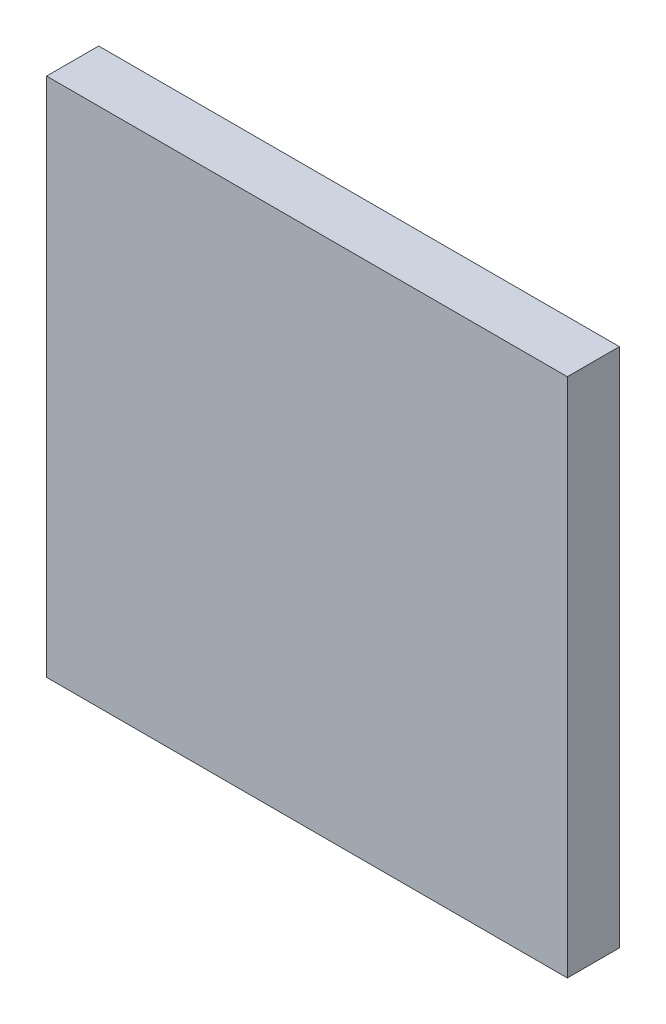
ISO-10303-21;
HEADER;
FILE_DESCRIPTION(('STEP AP214'),'2;1');
FILE_NAME('part.step','',(''),(''),'','','');
FILE_SCHEMA(('AUTOMOTIVE_DESIGN { 1 0 10303 214 1 1 1 1 }'));
ENDSEC;
DATA;
#1=APPLICATION_CONTEXT('core data for automotive mechanical design processes');
#2=APPLICATION_PROTOCOL_DEFINITION('international standard','automotive_design',2000,#1);
#3=PRODUCT_CONTEXT('',#1,'mechanical');
#4=PRODUCT('Part','Part','',(#3));
#5=PRODUCT_RELATED_PRODUCT_CATEGORY('part','',(#4));
#6=PRODUCT_DEFINITION_FORMATION('','',#4);
#7=PRODUCT_DEFINITION_CONTEXT('part definition',#1,'design');
#8=PRODUCT_DEFINITION('design','',#6,#7);
#9=PRODUCT_DEFINITION_SHAPE('','',#8);
#10=(LENGTH_UNIT() NAMED_UNIT(*) SI_UNIT(.MILLI.,.METRE.));
#11=(NAMED_UNIT(*) PLANE_ANGLE_UNIT() SI_UNIT($,.RADIAN.));
#12=(NAMED_UNIT(*) SI_UNIT($,.STERADIAN.) SOLID_ANGLE_UNIT());
#13=UNCERTAINTY_MEASURE_WITH_UNIT(LENGTH_MEASURE(1.E-05),#10,'distance_accuracy_value','');
#14=(GEOMETRIC_REPRESENTATION_CONTEXT(3) GLOBAL_UNCERTAINTY_ASSIGNED_CONTEXT((#13)) GLOBAL_UNIT_ASSIGNED_CONTEXT((#10,
#11,#12)) REPRESENTATION_CONTEXT('',''));
#15=CARTESIAN_POINT('',(0.,0.,0.));
#16=DIRECTION('',(0.,0.,1.));
#17=DIRECTION('',(1.,0.,0.));
#18=AXIS2_PLACEMENT_3D('',#15,#16,#17);
#19=CARTESIAN_POINT('',(0.,0.,100.));
#20=DIRECTION('',(0.,1.,0.));
#21=DIRECTION('',(0.,0.,1.));
#22=AXIS2_PLACEMENT_3D('',#19,#20,#21);
#23=PLANE('',#22);
#24=DIRECTION('',(0.,0.,-1.));
#25=VECTOR('',#24,1.);
#26=CARTESIAN_POINT('',(550.,0.,100.));
#27=LINE('',#26,#25);
#28=CARTESIAN_POINT('',(550.,0.,100.));
#29=VERTEX_POINT('',#28);
#30=CARTESIAN_POINT('',(550.,0.,0.));
#31=VERTEX_POINT('',#30);
#32=EDGE_CURVE('E11',#29,#31,#27,.T.);
#33=ORIENTED_EDGE('',*,*,#32,.F.);
#34=DIRECTION('',(1.,0.,0.));
#35=VECTOR('',#34,1.);
#36=CARTESIAN_POINT('',(0.,0.,100.));
#37=LINE('',#36,#35);
#38=CARTESIAN_POINT('',(450.,0.,100.));
#39=VERTEX_POINT('',#38);
#40=EDGE_CURVE('E100',#39,#29,#37,.T.);
#41=ORIENTED_EDGE('',*,*,#40,.F.);
#42=DIRECTION('',(0.,0.,-1.));
#43=VECTOR('',#42,1.);
#44=CARTESIAN_POINT('',(450.,0.,100.));
#45=LINE('',#44,#43);
#46=CARTESIAN_POINT('',(450.,0.,0.));
#47=VERTEX_POINT('',#46);
#48=EDGE_CURVE('E48',#39,#47,#45,.T.);
#49=ORIENTED_EDGE('',*,*,#48,.T.);
#50=DIRECTION('',(1.,0.,0.));
#51=VECTOR('',#50,1.);
#52=CARTESIAN_POINT('',(0.,0.,0.));
#53=LINE('',#52,#51);
#54=EDGE_CURVE('E131',#47,#31,#53,.T.);
#55=ORIENTED_EDGE('',*,*,#54,.T.);
#56=EDGE_LOOP('',(#33,#41,#49,#55));
#57=FACE_BOUND('',#56,.T.);
#58=ADVANCED_FACE('F39',(#57),#23,.F.);
#59=ORIENTED_EDGE('',*,*,#48,.F.);
#60=CARTESIAN_POINT('',(0.,0.,100.));
#61=VERTEX_POINT('',#60);
#62=EDGE_CURVE('E90',#61,#39,#37,.T.);
#63=ORIENTED_EDGE('',*,*,#62,.F.);
#64=DIRECTION('',(0.,0.,-1.));
#65=VECTOR('',#64,1.);
#66=CARTESIAN_POINT('',(0.,0.,100.));
#67=LINE('',#66,#65);
#68=CARTESIAN_POINT('',(0.,0.,0.));
#69=VERTEX_POINT('',#68);
#70=EDGE_CURVE('E95',#61,#69,#67,.T.);
#71=ORIENTED_EDGE('',*,*,#70,.T.);
#72=EDGE_CURVE('E129',#69,#47,#53,.T.);
#73=ORIENTED_EDGE('',*,*,#72,.T.);
#74=EDGE_LOOP('',(#59,#63,#71,#73));
#75=FACE_BOUND('',#74,.T.);
#76=ADVANCED_FACE('F92',(#75),#23,.F.);
#77=CARTESIAN_POINT('',(0.,0.,100.));
#78=DIRECTION('',(1.,0.,0.));
#79=DIRECTION('',(0.,0.,-1.));
#80=AXIS2_PLACEMENT_3D('',#77,#78,#79);
#81=PLANE('',#80);
#82=DIRECTION('',(0.,-1.,0.));
#83=VECTOR('',#82,1.);
#84=CARTESIAN_POINT('',(0.,0.,0.));
#85=LINE('',#84,#83);
#86=CARTESIAN_POINT('',(0.,1000.,0.));
#87=VERTEX_POINT('',#86);
#88=EDGE_CURVE('E114',#87,#69,#85,.T.);
#89=ORIENTED_EDGE('',*,*,#88,.T.);
#90=ORIENTED_EDGE('',*,*,#70,.F.);
#91=DIRECTION('',(0.,-1.,0.));
#92=VECTOR('',#91,1.);
#93=CARTESIAN_POINT('',(0.,0.,100.));
#94=LINE('',#93,#92);
#95=CARTESIAN_POINT('',(0.,1000.,100.));
#96=VERTEX_POINT('',#95);
#97=EDGE_CURVE('E104',#96,#61,#94,.T.);
#98=ORIENTED_EDGE('',*,*,#97,.F.);
#99=DIRECTION('',(0.,0.,-1.));
#100=VECTOR('',#99,1.);
#101=CARTESIAN_POINT('',(0.,1000.,100.));
#102=LINE('',#101,#100);
#103=EDGE_CURVE('E124',#96,#87,#102,.T.);
#104=ORIENTED_EDGE('',*,*,#103,.T.);
#105=EDGE_LOOP('',(#89,#90,#98,#104));
#106=FACE_BOUND('',#105,.T.);
#107=ADVANCED_FACE('F41',(#106),#81,.F.);
#108=CARTESIAN_POINT('',(1000.,0.,100.));
#109=VERTEX_POINT('',#108);
#110=EDGE_CURVE('E102',#29,#109,#37,.T.);
#111=ORIENTED_EDGE('',*,*,#110,.F.);
#112=ORIENTED_EDGE('',*,*,#32,.T.);
#113=CARTESIAN_POINT('',(1000.,0.,0.));
#114=VERTEX_POINT('',#113);
#115=EDGE_CURVE('E132',#31,#114,#53,.T.);
#116=ORIENTED_EDGE('',*,*,#115,.T.);
#117=DIRECTION('',(0.,0.,-1.));
#118=VECTOR('',#117,1.);
#119=CARTESIAN_POINT('',(1000.,0.,100.));
#120=LINE('',#119,#118);
#121=EDGE_CURVE('E115',#109,#114,#120,.T.);
#122=ORIENTED_EDGE('',*,*,#121,.F.);
#123=EDGE_LOOP('',(#111,#112,#116,#122));
#124=FACE_BOUND('',#123,.T.);
#125=ADVANCED_FACE('F147',(#124),#23,.F.);
#126=CARTESIAN_POINT('',(1000.,0.,100.));
#127=DIRECTION('',(-1.,0.,0.));
#128=DIRECTION('',(0.,0.,1.));
#129=AXIS2_PLACEMENT_3D('',#126,#127,#128);
#130=PLANE('',#129);
#131=DIRECTION('',(0.,1.,0.));
#132=VECTOR('',#131,1.);
#133=CARTESIAN_POINT('',(1000.,0.,0.));
#134=LINE('',#133,#132);
#135=CARTESIAN_POINT('',(1000.,1000.,0.));
#136=VERTEX_POINT('',#135);
#137=EDGE_CURVE('E127',#114,#136,#134,.T.);
#138=ORIENTED_EDGE('',*,*,#137,.T.);
#139=DIRECTION('',(0.,0.,-1.));
#140=VECTOR('',#139,1.);
#141=CARTESIAN_POINT('',(1000.,1000.,100.));
#142=LINE('',#141,#140);
#143=CARTESIAN_POINT('',(1000.,1000.,100.));
#144=VERTEX_POINT('',#143);
#145=EDGE_CURVE('E119',#144,#136,#142,.T.);
#146=ORIENTED_EDGE('',*,*,#145,.F.);
#147=DIRECTION('',(0.,1.,0.));
#148=VECTOR('',#147,1.);
#149=CARTESIAN_POINT('',(1000.,0.,100.));
#150=LINE('',#149,#148);
#151=EDGE_CURVE('E99',#109,#144,#150,.T.);
#152=ORIENTED_EDGE('',*,*,#151,.F.);
#153=ORIENTED_EDGE('',*,*,#121,.T.);
#154=EDGE_LOOP('',(#138,#146,#152,#153));
#155=FACE_BOUND('',#154,.T.);
#156=ADVANCED_FACE('F139',(#155),#130,.F.);
#157=CARTESIAN_POINT('',(0.,1000.,100.));
#158=DIRECTION('',(0.,-1.,0.));
#159=DIRECTION('',(0.,0.,-1.));
#160=AXIS2_PLACEMENT_3D('',#157,#158,#159);
#161=PLANE('',#160);
#162=DIRECTION('',(-1.,0.,0.));
#163=VECTOR('',#162,1.);
#164=CARTESIAN_POINT('',(0.,1000.,0.));
#165=LINE('',#164,#163);
#166=EDGE_CURVE('E111',#136,#87,#165,.T.);
#167=ORIENTED_EDGE('',*,*,#166,.T.);
#168=ORIENTED_EDGE('',*,*,#103,.F.);
#169=DIRECTION('',(-1.,0.,0.));
#170=VECTOR('',#169,1.);
#171=CARTESIAN_POINT('',(0.,1000.,100.));
#172=LINE('',#171,#170);
#173=EDGE_CURVE('E107',#144,#96,#172,.T.);
#174=ORIENTED_EDGE('',*,*,#173,.F.);
#175=ORIENTED_EDGE('',*,*,#145,.T.);
#176=EDGE_LOOP('',(#167,#168,#174,#175));
#177=FACE_BOUND('',#176,.T.);
#178=ADVANCED_FACE('F143',(#177),#161,.F.);
#179=CARTESIAN_POINT('',(0.,0.,100.));
#180=DIRECTION('',(0.,0.,-1.));
#181=DIRECTION('',(-1.,0.,0.));
#182=AXIS2_PLACEMENT_3D('',#179,#180,#181);
#183=PLANE('',#182);
#184=ORIENTED_EDGE('',*,*,#97,.T.);
#185=ORIENTED_EDGE('',*,*,#62,.T.);
#186=ORIENTED_EDGE('',*,*,#40,.T.);
#187=ORIENTED_EDGE('',*,*,#110,.T.);
#188=ORIENTED_EDGE('',*,*,#151,.T.);
#189=ORIENTED_EDGE('',*,*,#173,.T.);
#190=EDGE_LOOP('',(#184,#185,#186,#187,#188,#189));
#191=FACE_BOUND('',#190,.T.);
#192=ADVANCED_FACE('F105',(#191),#183,.F.);
#193=CARTESIAN_POINT('',(0.,0.,0.));
#194=DIRECTION('',(0.,0.,-1.));
#195=DIRECTION('',(-1.,0.,0.));
#196=AXIS2_PLACEMENT_3D('',#193,#194,#195);
#197=PLANE('',#196);
#198=ORIENTED_EDGE('',*,*,#88,.F.);
#199=ORIENTED_EDGE('',*,*,#166,.F.);
#200=ORIENTED_EDGE('',*,*,#137,.F.);
#201=ORIENTED_EDGE('',*,*,#115,.F.);
#202=ORIENTED_EDGE('',*,*,#54,.F.);
#203=ORIENTED_EDGE('',*,*,#72,.F.);
#204=EDGE_LOOP('',(#198,#199,#200,#201,#202,#203));
#205=FACE_BOUND('',#204,.T.);
#206=ADVANCED_FACE('F145',(#205),#197,.T.);
#207=CLOSED_SHELL('',(#58,#76,#107,#125,#156,#178,#192,#206));
#208=MANIFOLD_SOLID_BREP('B2',#207);
#209=ADVANCED_BREP_SHAPE_REPRESENTATION('',(#18,#208),#14);
#210=SHAPE_DEFINITION_REPRESENTATION(#9,#209);
ENDSEC;
END-ISO-10303-21;
